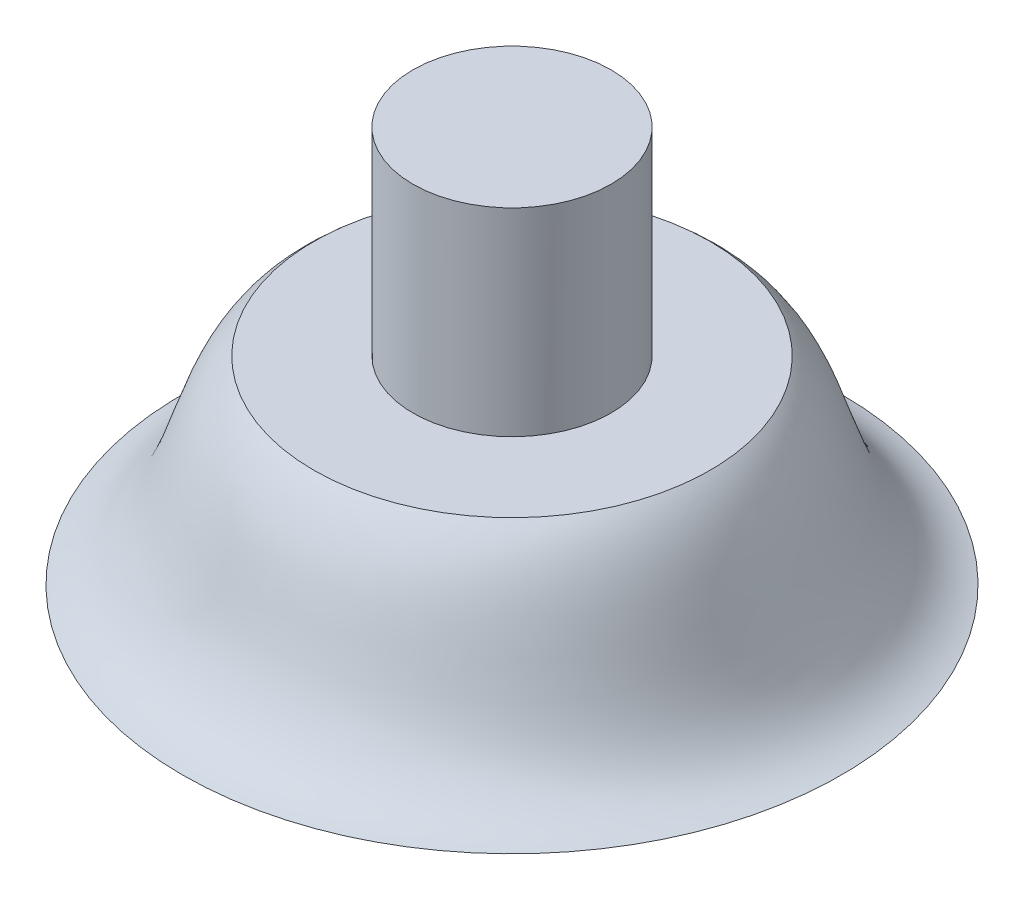
ISO-10303-21;
HEADER;
FILE_DESCRIPTION(('STEP AP214'),'2;1');
FILE_NAME('part.step','',(''),(''),'','','');
FILE_SCHEMA(('AUTOMOTIVE_DESIGN { 1 0 10303 214 1 1 1 1 }'));
ENDSEC;
DATA;
#1=APPLICATION_CONTEXT('core data for automotive mechanical design processes');
#2=APPLICATION_PROTOCOL_DEFINITION('international standard','automotive_design',2000,#1);
#3=PRODUCT_CONTEXT('',#1,'mechanical');
#4=PRODUCT('Part','Part','',(#3));
#5=PRODUCT_RELATED_PRODUCT_CATEGORY('part','',(#4));
#6=PRODUCT_DEFINITION_FORMATION('','',#4);
#7=PRODUCT_DEFINITION_CONTEXT('part definition',#1,'design');
#8=PRODUCT_DEFINITION('design','',#6,#7);
#9=PRODUCT_DEFINITION_SHAPE('','',#8);
#10=(LENGTH_UNIT() NAMED_UNIT(*) SI_UNIT(.MILLI.,.METRE.));
#11=(NAMED_UNIT(*) PLANE_ANGLE_UNIT() SI_UNIT($,.RADIAN.));
#12=(NAMED_UNIT(*) SI_UNIT($,.STERADIAN.) SOLID_ANGLE_UNIT());
#13=UNCERTAINTY_MEASURE_WITH_UNIT(LENGTH_MEASURE(1.E-05),#10,'distance_accuracy_value','');
#14=(GEOMETRIC_REPRESENTATION_CONTEXT(3) GLOBAL_UNCERTAINTY_ASSIGNED_CONTEXT((#13)) GLOBAL_UNIT_ASSIGNED_CONTEXT((#10,
#11,#12)) REPRESENTATION_CONTEXT('',''));
#15=CARTESIAN_POINT('',(0.,0.,0.));
#16=DIRECTION('',(0.,0.,1.));
#17=DIRECTION('',(1.,0.,0.));
#18=AXIS2_PLACEMENT_3D('',#15,#16,#17);
#19=CARTESIAN_POINT('',(0.,4.70126577332232,0.));
#20=DIRECTION('',(0.,-1.,0.));
#21=DIRECTION('',(0.,0.,-1.));
#22=AXIS2_PLACEMENT_3D('',#19,#20,#21);
#23=PLANE('',#22);
#24=CARTESIAN_POINT('',(16.628532391674,4.70126577332232,0.));
#25=DIRECTION('',(0.,1.,0.));
#26=DIRECTION('',(0.,0.,1.));
#27=AXIS2_PLACEMENT_3D('',#24,#25,#26);
#28=CIRCLE('',#27,10.);
#29=CARTESIAN_POINT('',(16.628532391674,4.70126577332232,10.));
#30=VERTEX_POINT('',#29);
#31=EDGE_CURVE('E45',#30,#30,#28,.T.);
#32=ORIENTED_EDGE('',*,*,#31,.T.);
#33=EDGE_LOOP('',(#32));
#34=FACE_BOUND('',#33,.T.);
#35=CARTESIAN_POINT('',(16.628532391674,4.70126577332232,0.));
#36=DIRECTION('',(0.,-1.,0.));
#37=DIRECTION('',(0.,0.,-1.));
#38=AXIS2_PLACEMENT_3D('',#35,#36,#37);
#39=CIRCLE('',#38,5.);
#40=CARTESIAN_POINT('',(16.628532391674,4.70126577332232,-5.));
#41=VERTEX_POINT('',#40);
#42=EDGE_CURVE('E10',#41,#41,#39,.F.);
#43=ORIENTED_EDGE('',*,*,#42,.F.);
#44=EDGE_LOOP('',(#43));
#45=FACE_BOUND('',#44,.T.);
#46=ADVANCED_FACE('F35',(#34,#45),#23,.F.);
#47=CARTESIAN_POINT('',(0.,-5.29873422667768,0.));
#48=DIRECTION('',(0.,1.,0.));
#49=DIRECTION('',(0.,0.,1.));
#50=AXIS2_PLACEMENT_3D('',#47,#48,#49);
#51=PLANE('',#50);
#52=CARTESIAN_POINT('',(16.628532391674,-5.29873422667768,0.));
#53=DIRECTION('',(0.,1.,0.));
#54=DIRECTION('',(0.,0.,1.));
#55=AXIS2_PLACEMENT_3D('',#52,#53,#54);
#56=CIRCLE('',#55,16.628532391674);
#57=CARTESIAN_POINT('',(16.628532391674,-5.29873422667768,16.628532391674));
#58=VERTEX_POINT('',#57);
#59=EDGE_CURVE('E41',#58,#58,#56,.T.);
#60=ORIENTED_EDGE('',*,*,#59,.F.);
#61=EDGE_LOOP('',(#60));
#62=FACE_BOUND('',#61,.T.);
#63=ADVANCED_FACE('F64',(#62),#51,.F.);
#64=CARTESIAN_POINT('',(33.257064783348,-5.29873422667768,0.));
#65=CARTESIAN_POINT('',(28.7856351812287,-4.23063915286587,0.));
#66=CARTESIAN_POINT('',(29.6766570048049,2.1866283430934,0.));
#67=CARTESIAN_POINT('',(26.628532391674,4.70126577332232,0.));
#68=B_SPLINE_CURVE_WITH_KNOTS('',3,(#64,#65,#66,#67),.UNSPECIFIED.,.F.,.F.,(4,4),(0.,1.),.UNSPECIFIED.);
#69=CARTESIAN_POINT('',(16.628532391674,4.70126577332232,0.));
#70=DIRECTION('',(0.,1.,0.));
#71=AXIS1_PLACEMENT('',#69,#70);
#72=SURFACE_OF_REVOLUTION('',#68,#71);
#73=ORIENTED_EDGE('',*,*,#31,.F.);
#74=EDGE_LOOP('',(#73));
#75=FACE_BOUND('',#74,.T.);
#76=ORIENTED_EDGE('',*,*,#59,.T.);
#77=EDGE_LOOP('',(#76));
#78=FACE_BOUND('',#77,.T.);
#79=ADVANCED_FACE('F60',(#75,#78),#72,.T.);
#80=CARTESIAN_POINT('',(16.628532391674,14.7012657733223,0.));
#81=DIRECTION('',(0.,-1.,0.));
#82=DIRECTION('',(0.,0.,-1.));
#83=AXIS2_PLACEMENT_3D('',#80,#81,#82);
#84=CYLINDRICAL_SURFACE('',#83,5.);
#85=CARTESIAN_POINT('',(16.628532391674,14.7012657733223,0.));
#86=DIRECTION('',(0.,1.,0.));
#87=DIRECTION('',(0.,0.,1.));
#88=AXIS2_PLACEMENT_3D('',#85,#86,#87);
#89=CIRCLE('',#88,5.);
#90=CARTESIAN_POINT('',(16.628532391674,14.7012657733223,5.));
#91=VERTEX_POINT('',#90);
#92=EDGE_CURVE('E49',#91,#91,#89,.T.);
#93=ORIENTED_EDGE('',*,*,#92,.F.);
#94=EDGE_LOOP('',(#93));
#95=FACE_BOUND('',#94,.T.);
#96=ORIENTED_EDGE('',*,*,#42,.T.);
#97=EDGE_LOOP('',(#96));
#98=FACE_BOUND('',#97,.T.);
#99=ADVANCED_FACE('F63',(#95,#98),#84,.T.);
#100=CARTESIAN_POINT('',(16.628532391674,14.7012657733223,0.));
#101=DIRECTION('',(0.,1.,0.));
#102=DIRECTION('',(0.,0.,1.));
#103=AXIS2_PLACEMENT_3D('',#100,#101,#102);
#104=PLANE('',#103);
#105=ORIENTED_EDGE('',*,*,#92,.T.);
#106=EDGE_LOOP('',(#105));
#107=FACE_BOUND('',#106,.T.);
#108=ADVANCED_FACE('F90',(#107),#104,.T.);
#109=CLOSED_SHELL('',(#46,#63,#79,#99,#108));
#110=MANIFOLD_SOLID_BREP('B2',#109);
#111=ADVANCED_BREP_SHAPE_REPRESENTATION('',(#18,#110),#14);
#112=SHAPE_DEFINITION_REPRESENTATION(#9,#111);
ENDSEC;
END-ISO-10303-21;
